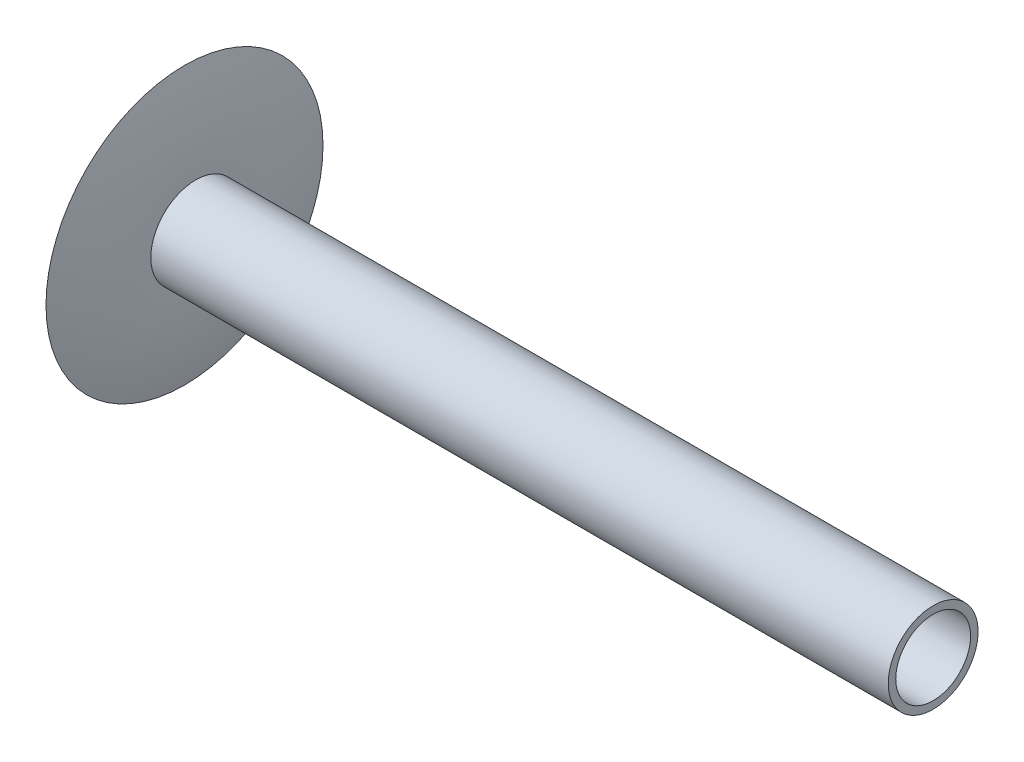
ISO-10303-21;
HEADER;
FILE_DESCRIPTION(('STEP AP214'),'2;1');
FILE_NAME('part.step','',(''),(''),'','','');
FILE_SCHEMA(('AUTOMOTIVE_DESIGN { 1 0 10303 214 1 1 1 1 }'));
ENDSEC;
DATA;
#1=APPLICATION_CONTEXT('core data for automotive mechanical design processes');
#2=APPLICATION_PROTOCOL_DEFINITION('international standard','automotive_design',2000,#1);
#3=PRODUCT_CONTEXT('',#1,'mechanical');
#4=PRODUCT('Part','Part','',(#3));
#5=PRODUCT_RELATED_PRODUCT_CATEGORY('part','',(#4));
#6=PRODUCT_DEFINITION_FORMATION('','',#4);
#7=PRODUCT_DEFINITION_CONTEXT('part definition',#1,'design');
#8=PRODUCT_DEFINITION('design','',#6,#7);
#9=PRODUCT_DEFINITION_SHAPE('','',#8);
#10=(LENGTH_UNIT() NAMED_UNIT(*) SI_UNIT(.MILLI.,.METRE.));
#11=(NAMED_UNIT(*) PLANE_ANGLE_UNIT() SI_UNIT($,.RADIAN.));
#12=(NAMED_UNIT(*) SI_UNIT($,.STERADIAN.) SOLID_ANGLE_UNIT());
#13=UNCERTAINTY_MEASURE_WITH_UNIT(LENGTH_MEASURE(1.E-05),#10,'distance_accuracy_value','');
#14=(GEOMETRIC_REPRESENTATION_CONTEXT(3) GLOBAL_UNCERTAINTY_ASSIGNED_CONTEXT((#13)) GLOBAL_UNIT_ASSIGNED_CONTEXT((#10,
#11,#12)) REPRESENTATION_CONTEXT('',''));
#15=CARTESIAN_POINT('',(0.,0.,0.));
#16=DIRECTION('',(0.,0.,1.));
#17=DIRECTION('',(1.,0.,0.));
#18=AXIS2_PLACEMENT_3D('',#15,#16,#17);
#19=CARTESIAN_POINT('',(-92.7593841988395,0.,0.));
#20=DIRECTION('',(-1.,0.,0.));
#21=DIRECTION('',(0.,0.,1.));
#22=AXIS2_PLACEMENT_3D('',#19,#20,#21);
#23=DEGENERATE_TOROIDAL_SURFACE('',#22,13.1888738961393,95.7667639804221,.T.);
#24=CARTESIAN_POINT('',(0.,0.,0.));
#25=DIRECTION('',(-1.,0.,0.));
#26=DIRECTION('',(0.,0.,1.));
#27=AXIS2_PLACEMENT_3D('',#24,#25,#26);
#28=CIRCLE('',#27,37.);
#29=CARTESIAN_POINT('',(0.,0.,37.));
#30=VERTEX_POINT('',#29);
#31=EDGE_CURVE('E62',#30,#30,#28,.T.);
#32=ORIENTED_EDGE('',*,*,#31,.F.);
#33=EDGE_LOOP('',(#32));
#34=FACE_BOUND('',#33,.T.);
#35=CARTESIAN_POINT('',(3.,0.,0.));
#36=DIRECTION('',(-1.,0.,0.));
#37=DIRECTION('',(0.,0.,1.));
#38=AXIS2_PLACEMENT_3D('',#35,#36,#37);
#39=CIRCLE('',#38,12.);
#40=CARTESIAN_POINT('',(3.,0.,12.));
#41=VERTEX_POINT('',#40);
#42=EDGE_CURVE('E10',#41,#41,#39,.T.);
#43=ORIENTED_EDGE('',*,*,#42,.T.);
#44=EDGE_LOOP('',(#43));
#45=FACE_BOUND('',#44,.T.);
#46=ADVANCED_FACE('F39',(#34,#45),#23,.T.);
#47=CARTESIAN_POINT('',(0.,0.,0.));
#48=DIRECTION('',(-1.,0.,0.));
#49=DIRECTION('',(0.,0.,1.));
#50=AXIS2_PLACEMENT_3D('',#47,#48,#49);
#51=CYLINDRICAL_SURFACE('',#50,12.);
#52=CARTESIAN_POINT('',(200.,0.,0.));
#53=DIRECTION('',(-1.,0.,0.));
#54=DIRECTION('',(0.,0.,1.));
#55=AXIS2_PLACEMENT_3D('',#52,#53,#54);
#56=CIRCLE('',#55,12.);
#57=CARTESIAN_POINT('',(200.,0.,12.));
#58=VERTEX_POINT('',#57);
#59=EDGE_CURVE('E46',#58,#58,#56,.T.);
#60=ORIENTED_EDGE('',*,*,#59,.T.);
#61=EDGE_LOOP('',(#60));
#62=FACE_BOUND('',#61,.T.);
#63=ORIENTED_EDGE('',*,*,#42,.F.);
#64=EDGE_LOOP('',(#63));
#65=FACE_BOUND('',#64,.T.);
#66=ADVANCED_FACE('F71',(#62,#65),#51,.T.);
#67=CARTESIAN_POINT('',(200.,0.,0.));
#68=DIRECTION('',(-1.,0.,0.));
#69=DIRECTION('',(0.,0.,1.));
#70=AXIS2_PLACEMENT_3D('',#67,#68,#69);
#71=PLANE('',#70);
#72=ORIENTED_EDGE('',*,*,#59,.F.);
#73=EDGE_LOOP('',(#72));
#74=FACE_BOUND('',#73,.T.);
#75=CARTESIAN_POINT('',(200.,0.,0.));
#76=DIRECTION('',(-1.,0.,0.));
#77=DIRECTION('',(0.,0.,1.));
#78=AXIS2_PLACEMENT_3D('',#75,#76,#77);
#79=CIRCLE('',#78,10.);
#80=CARTESIAN_POINT('',(200.,0.,10.));
#81=VERTEX_POINT('',#80);
#82=EDGE_CURVE('E51',#81,#81,#79,.T.);
#83=ORIENTED_EDGE('',*,*,#82,.T.);
#84=EDGE_LOOP('',(#83));
#85=FACE_BOUND('',#84,.T.);
#86=ADVANCED_FACE('F75',(#74,#85),#71,.F.);
#87=CARTESIAN_POINT('',(0.,0.,0.));
#88=DIRECTION('',(-1.,0.,0.));
#89=DIRECTION('',(0.,0.,1.));
#90=AXIS2_PLACEMENT_3D('',#87,#88,#89);
#91=CYLINDRICAL_SURFACE('',#90,10.);
#92=ORIENTED_EDGE('',*,*,#82,.F.);
#93=EDGE_LOOP('',(#92));
#94=FACE_BOUND('',#93,.T.);
#95=CARTESIAN_POINT('',(0.,0.,0.));
#96=DIRECTION('',(-1.,0.,0.));
#97=DIRECTION('',(0.,0.,1.));
#98=AXIS2_PLACEMENT_3D('',#95,#96,#97);
#99=CIRCLE('',#98,10.);
#100=CARTESIAN_POINT('',(0.,0.,10.));
#101=VERTEX_POINT('',#100);
#102=EDGE_CURVE('E56',#101,#101,#99,.T.);
#103=ORIENTED_EDGE('',*,*,#102,.T.);
#104=EDGE_LOOP('',(#103));
#105=FACE_BOUND('',#104,.T.);
#106=ADVANCED_FACE('F79',(#94,#105),#91,.F.);
#107=CARTESIAN_POINT('',(0.,0.,0.));
#108=DIRECTION('',(-1.,0.,0.));
#109=DIRECTION('',(0.,0.,1.));
#110=AXIS2_PLACEMENT_3D('',#107,#108,#109);
#111=PLANE('',#110);
#112=ORIENTED_EDGE('',*,*,#31,.T.);
#113=EDGE_LOOP('',(#112));
#114=FACE_BOUND('',#113,.T.);
#115=ORIENTED_EDGE('',*,*,#102,.F.);
#116=EDGE_LOOP('',(#115));
#117=FACE_BOUND('',#116,.T.);
#118=ADVANCED_FACE('F67',(#114,#117),#111,.T.);
#119=CLOSED_SHELL('',(#46,#66,#86,#106,#118));
#120=MANIFOLD_SOLID_BREP('B2',#119);
#121=ADVANCED_BREP_SHAPE_REPRESENTATION('',(#18,#120),#14);
#122=SHAPE_DEFINITION_REPRESENTATION(#9,#121);
ENDSEC;
END-ISO-10303-21;
